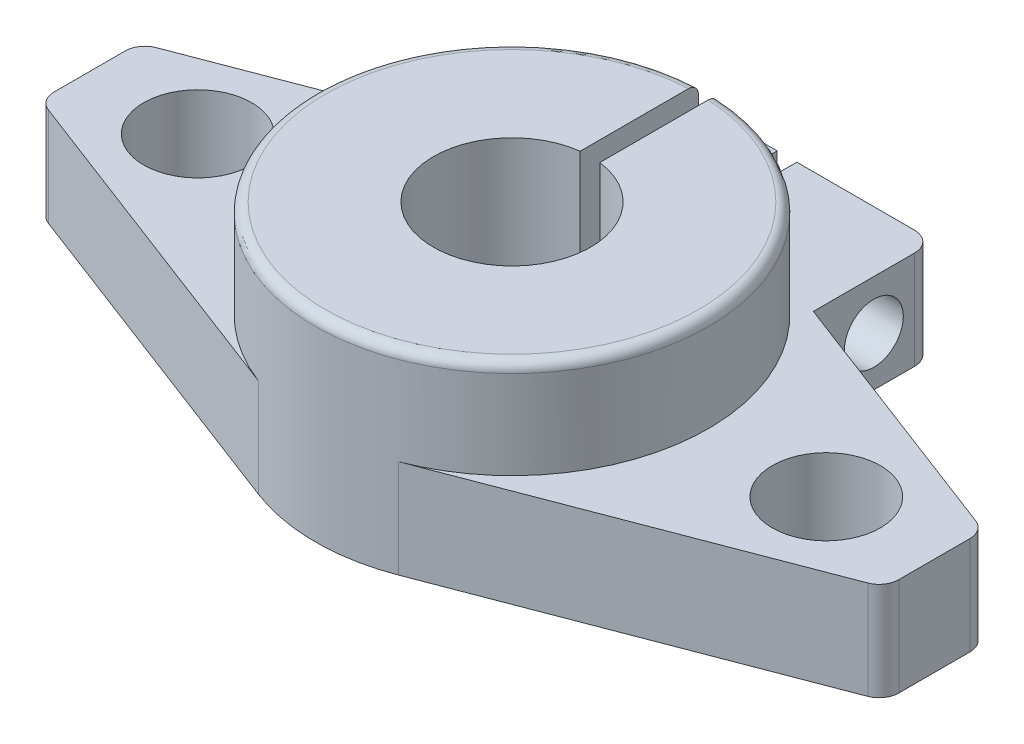
ISO-10303-21;
HEADER;
FILE_DESCRIPTION(('STEP AP214'),'2;1');
FILE_NAME('part.step','',(''),(''),'','','');
FILE_SCHEMA(('AUTOMOTIVE_DESIGN { 1 0 10303 214 1 1 1 1 }'));
ENDSEC;
DATA;
#1=APPLICATION_CONTEXT('core data for automotive mechanical design processes');
#2=APPLICATION_PROTOCOL_DEFINITION('international standard','automotive_design',2000,#1);
#3=PRODUCT_CONTEXT('',#1,'mechanical');
#4=PRODUCT('Part','Part','',(#3));
#5=PRODUCT_RELATED_PRODUCT_CATEGORY('part','',(#4));
#6=PRODUCT_DEFINITION_FORMATION('','',#4);
#7=PRODUCT_DEFINITION_CONTEXT('part definition',#1,'design');
#8=PRODUCT_DEFINITION('design','',#6,#7);
#9=PRODUCT_DEFINITION_SHAPE('','',#8);
#10=(LENGTH_UNIT() NAMED_UNIT(*) SI_UNIT(.MILLI.,.METRE.));
#11=(NAMED_UNIT(*) PLANE_ANGLE_UNIT() SI_UNIT($,.RADIAN.));
#12=(NAMED_UNIT(*) SI_UNIT($,.STERADIAN.) SOLID_ANGLE_UNIT());
#13=UNCERTAINTY_MEASURE_WITH_UNIT(LENGTH_MEASURE(1.E-05),#10,'distance_accuracy_value','');
#14=(GEOMETRIC_REPRESENTATION_CONTEXT(3) GLOBAL_UNCERTAINTY_ASSIGNED_CONTEXT((#13)) GLOBAL_UNIT_ASSIGNED_CONTEXT((#10,
#11,#12)) REPRESENTATION_CONTEXT('',''));
#15=CARTESIAN_POINT('',(0.,0.,0.));
#16=DIRECTION('',(0.,0.,1.));
#17=DIRECTION('',(1.,0.,0.));
#18=AXIS2_PLACEMENT_3D('',#15,#16,#17);
#19=CARTESIAN_POINT('',(0.,5.,0.));
#20=DIRECTION('',(0.,1.,0.));
#21=DIRECTION('',(0.,0.,1.));
#22=AXIS2_PLACEMENT_3D('',#19,#20,#21);
#23=PLANE('',#22);
#24=DIRECTION('',(-1.,0.,0.));
#25=VECTOR('',#24,1.);
#26=CARTESIAN_POINT('',(-0.5,5.,-14.));
#27=LINE('',#26,#25);
#28=CARTESIAN_POINT('',(-0.5,5.,-14.));
#29=VERTEX_POINT('',#28);
#30=CARTESIAN_POINT('',(-6.5,5.,-14.));
#31=VERTEX_POINT('',#30);
#32=EDGE_CURVE('E388',#29,#31,#27,.T.);
#33=ORIENTED_EDGE('',*,*,#32,.T.);
#34=CARTESIAN_POINT('',(-6.5,5.,-13.));
#35=DIRECTION('',(0.,1.,0.));
#36=DIRECTION('',(0.,0.,1.));
#37=AXIS2_PLACEMENT_3D('',#34,#35,#36);
#38=CIRCLE('',#37,1.);
#39=CARTESIAN_POINT('',(-7.5,5.,-13.));
#40=VERTEX_POINT('',#39);
#41=EDGE_CURVE('E11',#31,#40,#38,.T.);
#42=ORIENTED_EDGE('',*,*,#41,.T.);
#43=DIRECTION('',(0.,0.,1.));
#44=VECTOR('',#43,1.);
#45=CARTESIAN_POINT('',(-7.5,5.,-14.));
#46=LINE('',#45,#44);
#47=CARTESIAN_POINT('',(-7.5,5.,-7.84158601756617));
#48=VERTEX_POINT('',#47);
#49=EDGE_CURVE('E396',#40,#48,#46,.T.);
#50=ORIENTED_EDGE('',*,*,#49,.T.);
#51=DIRECTION('',(-0.93430439090657,0.,0.356476233615515));
#52=VECTOR('',#51,1.);
#53=CARTESIAN_POINT('',(-21.5,5.,-2.5));
#54=LINE('',#53,#52);
#55=CARTESIAN_POINT('',(-20.8564762336155,5.,-2.74553125374935));
#56=VERTEX_POINT('',#55);
#57=EDGE_CURVE('E398',#48,#56,#54,.T.);
#58=ORIENTED_EDGE('',*,*,#57,.T.);
#59=CARTESIAN_POINT('',(-20.5,5.,-1.81122686284278));
#60=DIRECTION('',(0.,1.,0.));
#61=DIRECTION('',(0.,0.,1.));
#62=AXIS2_PLACEMENT_3D('',#59,#60,#61);
#63=CIRCLE('',#62,1.);
#64=CARTESIAN_POINT('',(-21.5,5.,-1.81122686284278));
#65=VERTEX_POINT('',#64);
#66=EDGE_CURVE('E480',#56,#65,#63,.T.);
#67=ORIENTED_EDGE('',*,*,#66,.T.);
#68=DIRECTION('',(0.,0.,1.));
#69=VECTOR('',#68,1.);
#70=CARTESIAN_POINT('',(-21.5,5.,-2.5));
#71=LINE('',#70,#69);
#72=CARTESIAN_POINT('',(-21.5,5.,1.81122686284278));
#73=VERTEX_POINT('',#72);
#74=EDGE_CURVE('E349',#65,#73,#71,.T.);
#75=ORIENTED_EDGE('',*,*,#74,.T.);
#76=CARTESIAN_POINT('',(-20.5,5.,1.81122686284278));
#77=DIRECTION('',(0.,1.,0.));
#78=DIRECTION('',(0.,0.,1.));
#79=AXIS2_PLACEMENT_3D('',#76,#77,#78);
#80=CIRCLE('',#79,1.);
#81=CARTESIAN_POINT('',(-20.8564762336155,5.,2.74553125374935));
#82=VERTEX_POINT('',#81);
#83=EDGE_CURVE('E344',#73,#82,#80,.T.);
#84=ORIENTED_EDGE('',*,*,#83,.T.);
#85=DIRECTION('',(0.93430439090657,0.,0.356476233615515));
#86=VECTOR('',#85,1.);
#87=CARTESIAN_POINT('',(-21.5,5.,2.5));
#88=LINE('',#87,#86);
#89=CARTESIAN_POINT('',(-3.56476233615515,5.,9.3430439090657));
#90=VERTEX_POINT('',#89);
#91=EDGE_CURVE('E345',#82,#90,#88,.T.);
#92=ORIENTED_EDGE('',*,*,#91,.T.);
#93=CARTESIAN_POINT('',(0.,5.,0.));
#94=DIRECTION('',(0.,1.,0.));
#95=DIRECTION('',(0.,0.,1.));
#96=AXIS2_PLACEMENT_3D('',#93,#94,#95);
#97=CIRCLE('',#96,10.);
#98=CARTESIAN_POINT('',(-0.5,5.,-9.9874921777191));
#99=VERTEX_POINT('',#98);
#100=EDGE_CURVE('E217',#99,#90,#97,.T.);
#101=ORIENTED_EDGE('',*,*,#100,.F.);
#102=DIRECTION('',(0.,0.,-1.));
#103=VECTOR('',#102,1.);
#104=CARTESIAN_POINT('',(-0.5,5.,-9.98749217771909));
#105=LINE('',#104,#103);
#106=EDGE_CURVE('E386',#99,#29,#105,.T.);
#107=ORIENTED_EDGE('',*,*,#106,.T.);
#108=EDGE_LOOP('',(#33,#42,#50,#58,#67,#75,#84,#92,#101,#107));
#109=FACE_BOUND('',#108,.T.);
#110=CARTESIAN_POINT('',(-16.,5.,0.));
#111=DIRECTION('',(0.,1.,0.));
#112=DIRECTION('',(0.,0.,1.));
#113=AXIS2_PLACEMENT_3D('',#110,#111,#112);
#114=CIRCLE('',#113,2.75);
#115=CARTESIAN_POINT('',(-16.,5.,2.75));
#116=VERTEX_POINT('',#115);
#117=EDGE_CURVE('E416',#116,#116,#114,.T.);
#118=ORIENTED_EDGE('',*,*,#117,.F.);
#119=EDGE_LOOP('',(#118));
#120=FACE_BOUND('',#119,.T.);
#121=ADVANCED_FACE('F36',(#109,#120),#23,.T.);
#122=DIRECTION('',(0.,0.,-1.));
#123=VECTOR('',#122,1.);
#124=CARTESIAN_POINT('',(7.5,5.,-14.));
#125=LINE('',#124,#123);
#126=CARTESIAN_POINT('',(7.5,5.,-7.84158601756617));
#127=VERTEX_POINT('',#126);
#128=CARTESIAN_POINT('',(7.5,5.,-13.));
#129=VERTEX_POINT('',#128);
#130=EDGE_CURVE('E408',#127,#129,#125,.T.);
#131=ORIENTED_EDGE('',*,*,#130,.T.);
#132=CARTESIAN_POINT('',(6.5,5.,-13.));
#133=DIRECTION('',(0.,1.,0.));
#134=DIRECTION('',(0.,0.,1.));
#135=AXIS2_PLACEMENT_3D('',#132,#133,#134);
#136=CIRCLE('',#135,1.);
#137=CARTESIAN_POINT('',(6.5,5.,-14.));
#138=VERTEX_POINT('',#137);
#139=EDGE_CURVE('E498',#129,#138,#136,.T.);
#140=ORIENTED_EDGE('',*,*,#139,.T.);
#141=DIRECTION('',(-1.,0.,0.));
#142=VECTOR('',#141,1.);
#143=CARTESIAN_POINT('',(0.5,5.,-14.));
#144=LINE('',#143,#142);
#145=CARTESIAN_POINT('',(0.5,5.,-14.));
#146=VERTEX_POINT('',#145);
#147=EDGE_CURVE('E411',#138,#146,#144,.T.);
#148=ORIENTED_EDGE('',*,*,#147,.T.);
#149=DIRECTION('',(0.,0.,1.));
#150=VECTOR('',#149,1.);
#151=CARTESIAN_POINT('',(0.5,5.,-9.98749217771909));
#152=LINE('',#151,#150);
#153=CARTESIAN_POINT('',(0.5,5.,-9.98749217771909));
#154=VERTEX_POINT('',#153);
#155=EDGE_CURVE('E235',#146,#154,#152,.T.);
#156=ORIENTED_EDGE('',*,*,#155,.T.);
#157=CARTESIAN_POINT('',(3.56476233615516,5.,9.3430439090657));
#158=VERTEX_POINT('',#157);
#159=EDGE_CURVE('E200',#158,#154,#97,.T.);
#160=ORIENTED_EDGE('',*,*,#159,.F.);
#161=DIRECTION('',(0.93430439090657,0.,-0.356476233615515));
#162=VECTOR('',#161,1.);
#163=CARTESIAN_POINT('',(21.5,5.,2.5));
#164=LINE('',#163,#162);
#165=CARTESIAN_POINT('',(20.8564762336155,5.,2.74553125374935));
#166=VERTEX_POINT('',#165);
#167=EDGE_CURVE('E348',#158,#166,#164,.T.);
#168=ORIENTED_EDGE('',*,*,#167,.T.);
#169=CARTESIAN_POINT('',(20.5,5.,1.81122686284278));
#170=DIRECTION('',(0.,1.,0.));
#171=DIRECTION('',(0.,0.,1.));
#172=AXIS2_PLACEMENT_3D('',#169,#170,#171);
#173=CIRCLE('',#172,1.);
#174=CARTESIAN_POINT('',(21.5,5.,1.81122686284278));
#175=VERTEX_POINT('',#174);
#176=EDGE_CURVE('E329',#166,#175,#173,.T.);
#177=ORIENTED_EDGE('',*,*,#176,.T.);
#178=DIRECTION('',(0.,0.,-1.));
#179=VECTOR('',#178,1.);
#180=CARTESIAN_POINT('',(21.5,5.,-2.5));
#181=LINE('',#180,#179);
#182=CARTESIAN_POINT('',(21.5,5.,-1.81122686284278));
#183=VERTEX_POINT('',#182);
#184=EDGE_CURVE('E403',#175,#183,#181,.T.);
#185=ORIENTED_EDGE('',*,*,#184,.T.);
#186=CARTESIAN_POINT('',(20.5,5.,-1.81122686284278));
#187=DIRECTION('',(0.,1.,0.));
#188=DIRECTION('',(0.,0.,1.));
#189=AXIS2_PLACEMENT_3D('',#186,#187,#188);
#190=CIRCLE('',#189,1.);
#191=CARTESIAN_POINT('',(20.8564762336155,5.,-2.74553125374935));
#192=VERTEX_POINT('',#191);
#193=EDGE_CURVE('E477',#183,#192,#190,.T.);
#194=ORIENTED_EDGE('',*,*,#193,.T.);
#195=DIRECTION('',(-0.93430439090657,0.,-0.356476233615515));
#196=VECTOR('',#195,1.);
#197=CARTESIAN_POINT('',(21.5,5.,-2.5));
#198=LINE('',#197,#196);
#199=EDGE_CURVE('E406',#192,#127,#198,.T.);
#200=ORIENTED_EDGE('',*,*,#199,.T.);
#201=EDGE_LOOP('',(#131,#140,#148,#156,#160,#168,#177,#185,#194,#200));
#202=FACE_BOUND('',#201,.T.);
#203=CARTESIAN_POINT('',(16.,5.,0.));
#204=DIRECTION('',(0.,1.,0.));
#205=DIRECTION('',(0.,0.,1.));
#206=AXIS2_PLACEMENT_3D('',#203,#204,#205);
#207=CIRCLE('',#206,2.75);
#208=CARTESIAN_POINT('',(16.,5.,2.75));
#209=VERTEX_POINT('',#208);
#210=EDGE_CURVE('E769',#209,#209,#207,.T.);
#211=ORIENTED_EDGE('',*,*,#210,.F.);
#212=EDGE_LOOP('',(#211));
#213=FACE_BOUND('',#212,.T.);
#214=ADVANCED_FACE('F446',(#202,#213),#23,.T.);
#215=CARTESIAN_POINT('',(0.,0.,0.));
#216=DIRECTION('',(0.,1.,0.));
#217=DIRECTION('',(0.,0.,1.));
#218=AXIS2_PLACEMENT_3D('',#215,#216,#217);
#219=PLANE('',#218);
#220=CARTESIAN_POINT('',(-16.,0.,0.));
#221=DIRECTION('',(0.,1.,0.));
#222=DIRECTION('',(0.,0.,1.));
#223=AXIS2_PLACEMENT_3D('',#220,#221,#222);
#224=CIRCLE('',#223,2.75);
#225=CARTESIAN_POINT('',(-16.,0.,2.75));
#226=VERTEX_POINT('',#225);
#227=EDGE_CURVE('E393',#226,#226,#224,.T.);
#228=ORIENTED_EDGE('',*,*,#227,.T.);
#229=EDGE_LOOP('',(#228));
#230=FACE_BOUND('',#229,.T.);
#231=DIRECTION('',(-1.,0.,0.));
#232=VECTOR('',#231,1.);
#233=CARTESIAN_POINT('',(0.5,0.,-14.));
#234=LINE('',#233,#232);
#235=CARTESIAN_POINT('',(6.5,0.,-14.));
#236=VERTEX_POINT('',#235);
#237=CARTESIAN_POINT('',(0.5,0.,-14.));
#238=VERTEX_POINT('',#237);
#239=EDGE_CURVE('E441',#236,#238,#234,.T.);
#240=ORIENTED_EDGE('',*,*,#239,.F.);
#241=CARTESIAN_POINT('',(6.5,0.,-13.));
#242=DIRECTION('',(0.,1.,0.));
#243=DIRECTION('',(0.,0.,1.));
#244=AXIS2_PLACEMENT_3D('',#241,#242,#243);
#245=CIRCLE('',#244,1.);
#246=CARTESIAN_POINT('',(7.5,0.,-13.));
#247=VERTEX_POINT('',#246);
#248=EDGE_CURVE('E494',#236,#247,#245,.F.);
#249=ORIENTED_EDGE('',*,*,#248,.T.);
#250=DIRECTION('',(0.,0.,-1.));
#251=VECTOR('',#250,1.);
#252=CARTESIAN_POINT('',(7.5,0.,-14.));
#253=LINE('',#252,#251);
#254=CARTESIAN_POINT('',(7.5,0.,-7.84158601756617));
#255=VERTEX_POINT('',#254);
#256=EDGE_CURVE('E439',#255,#247,#253,.T.);
#257=ORIENTED_EDGE('',*,*,#256,.F.);
#258=DIRECTION('',(-0.93430439090657,0.,-0.356476233615515));
#259=VECTOR('',#258,1.);
#260=CARTESIAN_POINT('',(21.5,0.,-2.5));
#261=LINE('',#260,#259);
#262=CARTESIAN_POINT('',(20.8564762336155,0.,-2.74553125374935));
#263=VERTEX_POINT('',#262);
#264=EDGE_CURVE('E437',#263,#255,#261,.T.);
#265=ORIENTED_EDGE('',*,*,#264,.F.);
#266=CARTESIAN_POINT('',(20.5,0.,-1.81122686284278));
#267=DIRECTION('',(0.,1.,0.));
#268=DIRECTION('',(0.,0.,1.));
#269=AXIS2_PLACEMENT_3D('',#266,#267,#268);
#270=CIRCLE('',#269,1.);
#271=CARTESIAN_POINT('',(21.5,0.,-1.81122686284278));
#272=VERTEX_POINT('',#271);
#273=EDGE_CURVE('E336',#263,#272,#270,.F.);
#274=ORIENTED_EDGE('',*,*,#273,.T.);
#275=DIRECTION('',(0.,0.,-1.));
#276=VECTOR('',#275,1.);
#277=CARTESIAN_POINT('',(21.5,0.,-2.5));
#278=LINE('',#277,#276);
#279=CARTESIAN_POINT('',(21.5,0.,1.81122686284278));
#280=VERTEX_POINT('',#279);
#281=EDGE_CURVE('E434',#280,#272,#278,.T.);
#282=ORIENTED_EDGE('',*,*,#281,.F.);
#283=CARTESIAN_POINT('',(20.5,0.,1.81122686284278));
#284=DIRECTION('',(0.,1.,0.));
#285=DIRECTION('',(0.,0.,1.));
#286=AXIS2_PLACEMENT_3D('',#283,#284,#285);
#287=CIRCLE('',#286,1.);
#288=CARTESIAN_POINT('',(20.8564762336155,0.,2.74553125374935));
#289=VERTEX_POINT('',#288);
#290=EDGE_CURVE('E325',#280,#289,#287,.F.);
#291=ORIENTED_EDGE('',*,*,#290,.T.);
#292=DIRECTION('',(0.93430439090657,0.,-0.356476233615515));
#293=VECTOR('',#292,1.);
#294=CARTESIAN_POINT('',(21.5,0.,2.5));
#295=LINE('',#294,#293);
#296=CARTESIAN_POINT('',(3.56476233615516,0.,9.3430439090657));
#297=VERTEX_POINT('',#296);
#298=EDGE_CURVE('E432',#297,#289,#295,.T.);
#299=ORIENTED_EDGE('',*,*,#298,.F.);
#300=CARTESIAN_POINT('',(0.,0.,0.));
#301=DIRECTION('',(0.,1.,0.));
#302=DIRECTION('',(0.,0.,1.));
#303=AXIS2_PLACEMENT_3D('',#300,#301,#302);
#304=CIRCLE('',#303,10.);
#305=CARTESIAN_POINT('',(-3.56476233615515,0.,9.3430439090657));
#306=VERTEX_POINT('',#305);
#307=EDGE_CURVE('E430',#306,#297,#304,.T.);
#308=ORIENTED_EDGE('',*,*,#307,.F.);
#309=DIRECTION('',(0.93430439090657,0.,0.356476233615515));
#310=VECTOR('',#309,1.);
#311=CARTESIAN_POINT('',(-21.5,0.,2.5));
#312=LINE('',#311,#310);
#313=CARTESIAN_POINT('',(-20.8564762336155,0.,2.74553125374935));
#314=VERTEX_POINT('',#313);
#315=EDGE_CURVE('E428',#314,#306,#312,.T.);
#316=ORIENTED_EDGE('',*,*,#315,.F.);
#317=CARTESIAN_POINT('',(-20.5,0.,1.81122686284278));
#318=DIRECTION('',(0.,1.,0.));
#319=DIRECTION('',(0.,0.,1.));
#320=AXIS2_PLACEMENT_3D('',#317,#318,#319);
#321=CIRCLE('',#320,1.);
#322=CARTESIAN_POINT('',(-21.5,0.,1.81122686284278));
#323=VERTEX_POINT('',#322);
#324=EDGE_CURVE('E338',#314,#323,#321,.F.);
#325=ORIENTED_EDGE('',*,*,#324,.T.);
#326=DIRECTION('',(0.,0.,1.));
#327=VECTOR('',#326,1.);
#328=CARTESIAN_POINT('',(-21.5,0.,-2.5));
#329=LINE('',#328,#327);
#330=CARTESIAN_POINT('',(-21.5,0.,-1.81122686284278));
#331=VERTEX_POINT('',#330);
#332=EDGE_CURVE('E425',#331,#323,#329,.T.);
#333=ORIENTED_EDGE('',*,*,#332,.F.);
#334=CARTESIAN_POINT('',(-20.5,0.,-1.81122686284278));
#335=DIRECTION('',(0.,1.,0.));
#336=DIRECTION('',(0.,0.,1.));
#337=AXIS2_PLACEMENT_3D('',#334,#335,#336);
#338=CIRCLE('',#337,1.);
#339=CARTESIAN_POINT('',(-20.8564762336155,0.,-2.74553125374935));
#340=VERTEX_POINT('',#339);
#341=EDGE_CURVE('E340',#331,#340,#338,.F.);
#342=ORIENTED_EDGE('',*,*,#341,.T.);
#343=DIRECTION('',(-0.93430439090657,0.,0.356476233615515));
#344=VECTOR('',#343,1.);
#345=CARTESIAN_POINT('',(-21.5,0.,-2.5));
#346=LINE('',#345,#344);
#347=CARTESIAN_POINT('',(-7.5,0.,-7.84158601756617));
#348=VERTEX_POINT('',#347);
#349=EDGE_CURVE('E422',#348,#340,#346,.T.);
#350=ORIENTED_EDGE('',*,*,#349,.F.);
#351=DIRECTION('',(0.,0.,1.));
#352=VECTOR('',#351,1.);
#353=CARTESIAN_POINT('',(-7.5,0.,-14.));
#354=LINE('',#353,#352);
#355=CARTESIAN_POINT('',(-7.5,0.,-13.));
#356=VERTEX_POINT('',#355);
#357=EDGE_CURVE('E420',#356,#348,#354,.T.);
#358=ORIENTED_EDGE('',*,*,#357,.F.);
#359=CARTESIAN_POINT('',(-6.5,0.,-13.));
#360=DIRECTION('',(0.,1.,0.));
#361=DIRECTION('',(0.,0.,1.));
#362=AXIS2_PLACEMENT_3D('',#359,#360,#361);
#363=CIRCLE('',#362,1.);
#364=CARTESIAN_POINT('',(-6.5,0.,-14.));
#365=VERTEX_POINT('',#364);
#366=EDGE_CURVE('E492',#356,#365,#363,.F.);
#367=ORIENTED_EDGE('',*,*,#366,.T.);
#368=DIRECTION('',(-1.,0.,0.));
#369=VECTOR('',#368,1.);
#370=CARTESIAN_POINT('',(-0.5,0.,-14.));
#371=LINE('',#370,#369);
#372=CARTESIAN_POINT('',(-0.5,0.,-14.));
#373=VERTEX_POINT('',#372);
#374=EDGE_CURVE('E418',#373,#365,#371,.T.);
#375=ORIENTED_EDGE('',*,*,#374,.F.);
#376=DIRECTION('',(0.,0.,-1.));
#377=VECTOR('',#376,1.);
#378=CARTESIAN_POINT('',(-0.5,0.,-9.98749217771909));
#379=LINE('',#378,#377);
#380=CARTESIAN_POINT('',(-0.5,0.,-3.96862696659689));
#381=VERTEX_POINT('',#380);
#382=EDGE_CURVE('E415',#381,#373,#379,.T.);
#383=ORIENTED_EDGE('',*,*,#382,.F.);
#384=CARTESIAN_POINT('',(0.,0.,0.));
#385=DIRECTION('',(0.,-1.,0.));
#386=DIRECTION('',(0.,0.,1.));
#387=AXIS2_PLACEMENT_3D('',#384,#385,#386);
#388=CIRCLE('',#387,4.);
#389=CARTESIAN_POINT('',(0.5,0.,-3.96862696659689));
#390=VERTEX_POINT('',#389);
#391=EDGE_CURVE('E198',#390,#381,#388,.T.);
#392=ORIENTED_EDGE('',*,*,#391,.F.);
#393=DIRECTION('',(0.,0.,1.));
#394=VECTOR('',#393,1.);
#395=CARTESIAN_POINT('',(0.5,0.,-9.98749217771909));
#396=LINE('',#395,#394);
#397=EDGE_CURVE('E389',#238,#390,#396,.T.);
#398=ORIENTED_EDGE('',*,*,#397,.F.);
#399=EDGE_LOOP('',(#240,#249,#257,#265,#274,#282,#291,#299,#308,#316,#325,#333,#342,#350,#358,
#367,#375,#383,#392,#398));
#400=FACE_BOUND('',#399,.T.);
#401=CARTESIAN_POINT('',(16.,0.,0.));
#402=DIRECTION('',(0.,1.,0.));
#403=DIRECTION('',(0.,0.,1.));
#404=AXIS2_PLACEMENT_3D('',#401,#402,#403);
#405=CIRCLE('',#404,2.75);
#406=CARTESIAN_POINT('',(16.,0.,2.75));
#407=VERTEX_POINT('',#406);
#408=EDGE_CURVE('E767',#407,#407,#405,.T.);
#409=ORIENTED_EDGE('',*,*,#408,.T.);
#410=EDGE_LOOP('',(#409));
#411=FACE_BOUND('',#410,.T.);
#412=ADVANCED_FACE('F269',(#230,#400,#411),#219,.F.);
#413=CARTESIAN_POINT('',(0.,5.,0.));
#414=DIRECTION('',(0.,-1.,0.));
#415=DIRECTION('',(0.,0.,-1.));
#416=AXIS2_PLACEMENT_3D('',#413,#414,#415);
#417=CYLINDRICAL_SURFACE('',#416,4.);
#418=ORIENTED_EDGE('',*,*,#391,.T.);
#419=DIRECTION('',(0.,-1.,0.));
#420=VECTOR('',#419,1.);
#421=CARTESIAN_POINT('',(-0.5,5.,-3.96862696659689));
#422=LINE('',#421,#420);
#423=CARTESIAN_POINT('',(-0.5,10.,-3.96862696659689));
#424=VERTEX_POINT('',#423);
#425=EDGE_CURVE('E191',#424,#381,#422,.T.);
#426=ORIENTED_EDGE('',*,*,#425,.F.);
#427=CARTESIAN_POINT('',(0.,10.,0.));
#428=DIRECTION('',(0.,-1.,0.));
#429=DIRECTION('',(0.,0.,1.));
#430=AXIS2_PLACEMENT_3D('',#427,#428,#429);
#431=CIRCLE('',#430,4.);
#432=CARTESIAN_POINT('',(0.5,10.,-3.96862696659689));
#433=VERTEX_POINT('',#432);
#434=EDGE_CURVE('E196',#433,#424,#431,.T.);
#435=ORIENTED_EDGE('',*,*,#434,.F.);
#436=DIRECTION('',(0.,-1.,0.));
#437=VECTOR('',#436,1.);
#438=CARTESIAN_POINT('',(0.5,5.,-3.96862696659689));
#439=LINE('',#438,#437);
#440=EDGE_CURVE('E381',#433,#390,#439,.T.);
#441=ORIENTED_EDGE('',*,*,#440,.T.);
#442=EDGE_LOOP('',(#418,#426,#435,#441));
#443=FACE_BOUND('',#442,.T.);
#444=ADVANCED_FACE('F193',(#443),#417,.F.);
#445=CARTESIAN_POINT('',(-0.5,5.,-9.98749217771909));
#446=DIRECTION('',(-1.,0.,0.));
#447=DIRECTION('',(0.,0.,1.));
#448=AXIS2_PLACEMENT_3D('',#445,#446,#447);
#449=PLANE('',#448);
#450=CARTESIAN_POINT('',(-0.5,2.5,-10.9207930087831));
#451=DIRECTION('',(-1.,0.,0.));
#452=DIRECTION('',(0.,0.,1.));
#453=AXIS2_PLACEMENT_3D('',#450,#451,#452);
#454=CIRCLE('',#453,1.5);
#455=CARTESIAN_POINT('',(-0.500000000000001,2.5,-9.42079300878309));
#456=VERTEX_POINT('',#455);
#457=EDGE_CURVE('E220',#456,#456,#454,.T.);
#458=ORIENTED_EDGE('',*,*,#457,.T.);
#459=EDGE_LOOP('',(#458));
#460=FACE_BOUND('',#459,.T.);
#461=DIRECTION('',(0.,-1.,0.));
#462=VECTOR('',#461,1.);
#463=CARTESIAN_POINT('',(-0.499999999999997,10.,-9.9874921777191));
#464=LINE('',#463,#462);
#465=CARTESIAN_POINT('',(-0.499999999999997,9.5,-9.9874921777191));
#466=VERTEX_POINT('',#465);
#467=EDGE_CURVE('E245',#466,#99,#464,.T.);
#468=ORIENTED_EDGE('',*,*,#467,.F.);
#469=CARTESIAN_POINT('',(-0.499999999999997,9.5,-9.98749217771909));
#470=CARTESIAN_POINT('',(-0.499999999999999,9.52810326861318,-9.98751620948402));
#471=CARTESIAN_POINT('',(-0.5,9.55619919985415,-9.9851212731618));
#472=CARTESIAN_POINT('',(-0.500000000000001,9.61157346459877,-9.97567103551276));
#473=CARTESIAN_POINT('',(-0.5,9.63885244876249,-9.96861955198559));
#474=CARTESIAN_POINT('',(-0.5,9.69185089269416,-9.95002890297945));
#475=CARTESIAN_POINT('',(-0.5,9.71756961551152,-9.93848763564793));
#476=CARTESIAN_POINT('',(-0.5,9.76670190365465,-9.91125685072349));
#477=CARTESIAN_POINT('',(-0.5,9.79011585205196,-9.89556802409042));
#478=CARTESIAN_POINT('',(-0.5,9.83399284156846,-9.86047698889603));
#479=CARTESIAN_POINT('',(-0.5,9.85445432014158,-9.84107282660264));
#480=CARTESIAN_POINT('',(-0.5,9.89183796761889,-9.7991040074595));
#481=CARTESIAN_POINT('',(-0.5,9.90875943669601,-9.77653872715537));
#482=CARTESIAN_POINT('',(-0.5,9.9386017876494,-9.72886107668858));
#483=CARTESIAN_POINT('',(-0.5,9.95151709682579,-9.70374522244322));
#484=CARTESIAN_POINT('',(-0.5,9.97294712330037,-9.65170829204656));
#485=CARTESIAN_POINT('',(-0.5,9.98146433049339,-9.6247882470754));
#486=CARTESIAN_POINT('',(-0.5,9.99176417502659,-9.57922815460075));
#487=CARTESIAN_POINT('',(-0.5,9.99485077045508,-9.56087222424545));
#488=CARTESIAN_POINT('',(-0.5,9.9989684284394,-9.52395772198814));
#489=CARTESIAN_POINT('',(-0.5,10.0000024064873,-9.50539947520595));
#490=CARTESIAN_POINT('',(-0.5,10.,-9.48683298050514));
#491=B_SPLINE_CURVE_WITH_KNOTS('',3,(#469,#470,#471,#472,#473,#474,#475,#476,#477,#478,#479,
#480,#481,#482,#483,#484,#485,#486,#487,#488,#489,#490),.UNSPECIFIED.,.F.,.F.,(4,2,2,2,2,2,2,2,
2,2,4),(0.,0.0841973902555138,0.168325834504239,0.252493710225416,0.336647572882433,
0.420845810508162,0.505060677648273,0.589392170465926,0.673675868259291,0.729409740916319,
0.785064393618538),.UNSPECIFIED.);
#492=CARTESIAN_POINT('',(-0.5,10.,-9.48683298050514));
#493=VERTEX_POINT('',#492);
#494=EDGE_CURVE('E208',#466,#493,#491,.T.);
#495=ORIENTED_EDGE('',*,*,#494,.T.);
#496=DIRECTION('',(0.,0.,-1.));
#497=VECTOR('',#496,1.);
#498=CARTESIAN_POINT('',(-0.5,10.,-3.96862696659689));
#499=LINE('',#498,#497);
#500=EDGE_CURVE('E204',#424,#493,#499,.T.);
#501=ORIENTED_EDGE('',*,*,#500,.F.);
#502=ORIENTED_EDGE('',*,*,#425,.T.);
#503=ORIENTED_EDGE('',*,*,#382,.T.);
#504=DIRECTION('',(0.,-1.,0.));
#505=VECTOR('',#504,1.);
#506=CARTESIAN_POINT('',(-0.5,5.,-14.));
#507=LINE('',#506,#505);
#508=EDGE_CURVE('E201',#29,#373,#507,.T.);
#509=ORIENTED_EDGE('',*,*,#508,.F.);
#510=ORIENTED_EDGE('',*,*,#106,.F.);
#511=EDGE_LOOP('',(#468,#495,#501,#502,#503,#509,#510));
#512=FACE_BOUND('',#511,.T.);
#513=ADVANCED_FACE('F206',(#460,#512),#449,.F.);
#514=CARTESIAN_POINT('',(-0.5,5.,-14.));
#515=DIRECTION('',(0.,0.,1.));
#516=DIRECTION('',(1.,0.,0.));
#517=AXIS2_PLACEMENT_3D('',#514,#515,#516);
#518=PLANE('',#517);
#519=ORIENTED_EDGE('',*,*,#374,.T.);
#520=DIRECTION('',(0.,-1.,0.));
#521=VECTOR('',#520,1.);
#522=CARTESIAN_POINT('',(-6.5,5.,-14.));
#523=LINE('',#522,#521);
#524=EDGE_CURVE('E44',#365,#31,#523,.F.);
#525=ORIENTED_EDGE('',*,*,#524,.T.);
#526=ORIENTED_EDGE('',*,*,#32,.F.);
#527=ORIENTED_EDGE('',*,*,#508,.T.);
#528=EDGE_LOOP('',(#519,#525,#526,#527));
#529=FACE_BOUND('',#528,.T.);
#530=ADVANCED_FACE('F309',(#529),#518,.F.);
#531=CARTESIAN_POINT('',(-7.5,5.,-14.));
#532=DIRECTION('',(1.,0.,0.));
#533=DIRECTION('',(0.,0.,-1.));
#534=AXIS2_PLACEMENT_3D('',#531,#532,#533);
#535=PLANE('',#534);
#536=CARTESIAN_POINT('',(-7.5,2.5,-10.9207930087831));
#537=DIRECTION('',(1.,0.,0.));
#538=DIRECTION('',(0.,0.,-1.));
#539=AXIS2_PLACEMENT_3D('',#536,#537,#538);
#540=CIRCLE('',#539,1.5);
#541=CARTESIAN_POINT('',(-7.5,2.5,-12.4207930087831));
#542=VERTEX_POINT('',#541);
#543=EDGE_CURVE('E488',#542,#542,#540,.T.);
#544=ORIENTED_EDGE('',*,*,#543,.T.);
#545=EDGE_LOOP('',(#544));
#546=FACE_BOUND('',#545,.T.);
#547=ORIENTED_EDGE('',*,*,#49,.F.);
#548=DIRECTION('',(0.,-1.,0.));
#549=VECTOR('',#548,1.);
#550=CARTESIAN_POINT('',(-7.5,5.,-13.));
#551=LINE('',#550,#549);
#552=EDGE_CURVE('E500',#40,#356,#551,.T.);
#553=ORIENTED_EDGE('',*,*,#552,.T.);
#554=ORIENTED_EDGE('',*,*,#357,.T.);
#555=DIRECTION('',(0.,-1.,0.));
#556=VECTOR('',#555,1.);
#557=CARTESIAN_POINT('',(-7.5,5.,-7.84158601756617));
#558=LINE('',#557,#556);
#559=EDGE_CURVE('E359',#48,#348,#558,.T.);
#560=ORIENTED_EDGE('',*,*,#559,.F.);
#561=EDGE_LOOP('',(#547,#553,#554,#560));
#562=FACE_BOUND('',#561,.T.);
#563=ADVANCED_FACE('F305',(#546,#562),#535,.F.);
#564=CARTESIAN_POINT('',(-21.5,5.,-2.5));
#565=DIRECTION('',(0.356476233615515,0.,0.93430439090657));
#566=DIRECTION('',(0.93430439090657,0.,-0.356476233615515));
#567=AXIS2_PLACEMENT_3D('',#564,#565,#566);
#568=PLANE('',#567);
#569=ORIENTED_EDGE('',*,*,#349,.T.);
#570=DIRECTION('',(0.,-1.,0.));
#571=VECTOR('',#570,1.);
#572=CARTESIAN_POINT('',(-20.8564762336155,5.,-2.74553125374935));
#573=LINE('',#572,#571);
#574=EDGE_CURVE('E342',#340,#56,#573,.F.);
#575=ORIENTED_EDGE('',*,*,#574,.T.);
#576=ORIENTED_EDGE('',*,*,#57,.F.);
#577=ORIENTED_EDGE('',*,*,#559,.T.);
#578=EDGE_LOOP('',(#569,#575,#576,#577));
#579=FACE_BOUND('',#578,.T.);
#580=ADVANCED_FACE('F301',(#579),#568,.F.);
#581=CARTESIAN_POINT('',(-21.5,5.,-2.5));
#582=DIRECTION('',(1.,0.,0.));
#583=DIRECTION('',(0.,0.,-1.));
#584=AXIS2_PLACEMENT_3D('',#581,#582,#583);
#585=PLANE('',#584);
#586=ORIENTED_EDGE('',*,*,#74,.F.);
#587=DIRECTION('',(0.,-1.,0.));
#588=VECTOR('',#587,1.);
#589=CARTESIAN_POINT('',(-21.5,5.,-1.81122686284278));
#590=LINE('',#589,#588);
#591=EDGE_CURVE('E333',#65,#331,#590,.T.);
#592=ORIENTED_EDGE('',*,*,#591,.T.);
#593=ORIENTED_EDGE('',*,*,#332,.T.);
#594=DIRECTION('',(0.,-1.,0.));
#595=VECTOR('',#594,1.);
#596=CARTESIAN_POINT('',(-21.5,5.,1.81122686284278));
#597=LINE('',#596,#595);
#598=EDGE_CURVE('E331',#323,#73,#597,.F.);
#599=ORIENTED_EDGE('',*,*,#598,.T.);
#600=EDGE_LOOP('',(#586,#592,#593,#599));
#601=FACE_BOUND('',#600,.T.);
#602=ADVANCED_FACE('F297',(#601),#585,.F.);
#603=CARTESIAN_POINT('',(-21.5,5.,2.5));
#604=DIRECTION('',(0.356476233615515,0.,-0.93430439090657));
#605=DIRECTION('',(-0.93430439090657,0.,-0.356476233615515));
#606=AXIS2_PLACEMENT_3D('',#603,#604,#605);
#607=PLANE('',#606);
#608=ORIENTED_EDGE('',*,*,#91,.F.);
#609=DIRECTION('',(0.,-1.,0.));
#610=VECTOR('',#609,1.);
#611=CARTESIAN_POINT('',(-20.8564762336155,5.,2.74553125374935));
#612=LINE('',#611,#610);
#613=EDGE_CURVE('E475',#82,#314,#612,.T.);
#614=ORIENTED_EDGE('',*,*,#613,.T.);
#615=ORIENTED_EDGE('',*,*,#315,.T.);
#616=DIRECTION('',(0.,-1.,0.));
#617=VECTOR('',#616,1.);
#618=CARTESIAN_POINT('',(-3.56476233615515,5.,9.3430439090657));
#619=LINE('',#618,#617);
#620=EDGE_CURVE('E356',#90,#306,#619,.T.);
#621=ORIENTED_EDGE('',*,*,#620,.F.);
#622=EDGE_LOOP('',(#608,#614,#615,#621));
#623=FACE_BOUND('',#622,.T.);
#624=ADVANCED_FACE('F293',(#623),#607,.F.);
#625=CARTESIAN_POINT('',(0.,5.,0.));
#626=DIRECTION('',(0.,-1.,0.));
#627=DIRECTION('',(0.,0.,-1.));
#628=AXIS2_PLACEMENT_3D('',#625,#626,#627);
#629=CYLINDRICAL_SURFACE('',#628,10.);
#630=DIRECTION('',(0.,-1.,0.));
#631=VECTOR('',#630,1.);
#632=CARTESIAN_POINT('',(0.5,10.,-9.98749217771909));
#633=LINE('',#632,#631);
#634=CARTESIAN_POINT('',(0.5,9.5,-9.98749217771909));
#635=VERTEX_POINT('',#634);
#636=EDGE_CURVE('E226',#635,#154,#633,.T.);
#637=ORIENTED_EDGE('',*,*,#636,.F.);
#638=CARTESIAN_POINT('',(0.,9.5,0.));
#639=DIRECTION('',(0.,1.,0.));
#640=DIRECTION('',(0.,0.,1.));
#641=AXIS2_PLACEMENT_3D('',#638,#639,#640);
#642=CIRCLE('',#641,10.);
#643=EDGE_CURVE('E255',#635,#466,#642,.F.);
#644=ORIENTED_EDGE('',*,*,#643,.T.);
#645=ORIENTED_EDGE('',*,*,#467,.T.);
#646=ORIENTED_EDGE('',*,*,#100,.T.);
#647=ORIENTED_EDGE('',*,*,#620,.T.);
#648=ORIENTED_EDGE('',*,*,#307,.T.);
#649=DIRECTION('',(0.,-1.,0.));
#650=VECTOR('',#649,1.);
#651=CARTESIAN_POINT('',(3.56476233615516,5.,9.3430439090657));
#652=LINE('',#651,#650);
#653=EDGE_CURVE('E240',#158,#297,#652,.T.);
#654=ORIENTED_EDGE('',*,*,#653,.F.);
#655=ORIENTED_EDGE('',*,*,#159,.T.);
#656=EDGE_LOOP('',(#637,#644,#645,#646,#647,#648,#654,#655));
#657=FACE_BOUND('',#656,.T.);
#658=ADVANCED_FACE('F289',(#657),#629,.T.);
#659=CARTESIAN_POINT('',(21.5,5.,2.5));
#660=DIRECTION('',(-0.356476233615515,0.,-0.93430439090657));
#661=DIRECTION('',(-0.93430439090657,0.,0.356476233615515));
#662=AXIS2_PLACEMENT_3D('',#659,#660,#661);
#663=PLANE('',#662);
#664=ORIENTED_EDGE('',*,*,#298,.T.);
#665=DIRECTION('',(0.,-1.,0.));
#666=VECTOR('',#665,1.);
#667=CARTESIAN_POINT('',(20.8564762336155,5.,2.74553125374935));
#668=LINE('',#667,#666);
#669=EDGE_CURVE('E327',#289,#166,#668,.F.);
#670=ORIENTED_EDGE('',*,*,#669,.T.);
#671=ORIENTED_EDGE('',*,*,#167,.F.);
#672=ORIENTED_EDGE('',*,*,#653,.T.);
#673=EDGE_LOOP('',(#664,#670,#671,#672));
#674=FACE_BOUND('',#673,.T.);
#675=ADVANCED_FACE('F285',(#674),#663,.F.);
#676=CARTESIAN_POINT('',(21.5,5.,-2.5));
#677=DIRECTION('',(-1.,0.,0.));
#678=DIRECTION('',(0.,0.,1.));
#679=AXIS2_PLACEMENT_3D('',#676,#677,#678);
#680=PLANE('',#679);
#681=ORIENTED_EDGE('',*,*,#281,.T.);
#682=DIRECTION('',(0.,-1.,0.));
#683=VECTOR('',#682,1.);
#684=CARTESIAN_POINT('',(21.5,5.,-1.81122686284278));
#685=LINE('',#684,#683);
#686=EDGE_CURVE('E473',#272,#183,#685,.F.);
#687=ORIENTED_EDGE('',*,*,#686,.T.);
#688=ORIENTED_EDGE('',*,*,#184,.F.);
#689=DIRECTION('',(0.,-1.,0.));
#690=VECTOR('',#689,1.);
#691=CARTESIAN_POINT('',(21.5,5.,1.81122686284278));
#692=LINE('',#691,#690);
#693=EDGE_CURVE('E322',#175,#280,#692,.T.);
#694=ORIENTED_EDGE('',*,*,#693,.T.);
#695=EDGE_LOOP('',(#681,#687,#688,#694));
#696=FACE_BOUND('',#695,.T.);
#697=ADVANCED_FACE('F281',(#696),#680,.F.);
#698=CARTESIAN_POINT('',(21.5,5.,-2.5));
#699=DIRECTION('',(-0.356476233615515,0.,0.93430439090657));
#700=DIRECTION('',(0.93430439090657,0.,0.356476233615515));
#701=AXIS2_PLACEMENT_3D('',#698,#699,#700);
#702=PLANE('',#701);
#703=ORIENTED_EDGE('',*,*,#199,.F.);
#704=DIRECTION('',(0.,-1.,0.));
#705=VECTOR('',#704,1.);
#706=CARTESIAN_POINT('',(20.8564762336155,5.,-2.74553125374935));
#707=LINE('',#706,#705);
#708=EDGE_CURVE('E472',#192,#263,#707,.T.);
#709=ORIENTED_EDGE('',*,*,#708,.T.);
#710=ORIENTED_EDGE('',*,*,#264,.T.);
#711=DIRECTION('',(0.,-1.,0.));
#712=VECTOR('',#711,1.);
#713=CARTESIAN_POINT('',(7.5,5.,-7.84158601756617));
#714=LINE('',#713,#712);
#715=EDGE_CURVE('E367',#127,#255,#714,.T.);
#716=ORIENTED_EDGE('',*,*,#715,.F.);
#717=EDGE_LOOP('',(#703,#709,#710,#716));
#718=FACE_BOUND('',#717,.T.);
#719=ADVANCED_FACE('F277',(#718),#702,.F.);
#720=CARTESIAN_POINT('',(7.5,5.,-14.));
#721=DIRECTION('',(-1.,0.,0.));
#722=DIRECTION('',(0.,0.,1.));
#723=AXIS2_PLACEMENT_3D('',#720,#721,#722);
#724=PLANE('',#723);
#725=CARTESIAN_POINT('',(7.5,2.5,-10.9207930087831));
#726=DIRECTION('',(1.,0.,0.));
#727=DIRECTION('',(0.,0.,-1.));
#728=AXIS2_PLACEMENT_3D('',#725,#726,#727);
#729=CIRCLE('',#728,1.5);
#730=CARTESIAN_POINT('',(7.5,2.5,-12.4207930087831));
#731=VERTEX_POINT('',#730);
#732=EDGE_CURVE('E489',#731,#731,#729,.T.);
#733=ORIENTED_EDGE('',*,*,#732,.F.);
#734=EDGE_LOOP('',(#733));
#735=FACE_BOUND('',#734,.T.);
#736=ORIENTED_EDGE('',*,*,#256,.T.);
#737=DIRECTION('',(0.,-1.,0.));
#738=VECTOR('',#737,1.);
#739=CARTESIAN_POINT('',(7.5,5.,-13.));
#740=LINE('',#739,#738);
#741=EDGE_CURVE('E496',#247,#129,#740,.F.);
#742=ORIENTED_EDGE('',*,*,#741,.T.);
#743=ORIENTED_EDGE('',*,*,#130,.F.);
#744=ORIENTED_EDGE('',*,*,#715,.T.);
#745=EDGE_LOOP('',(#736,#742,#743,#744));
#746=FACE_BOUND('',#745,.T.);
#747=ADVANCED_FACE('F273',(#735,#746),#724,.F.);
#748=CARTESIAN_POINT('',(0.5,5.,-14.));
#749=DIRECTION('',(0.,0.,1.));
#750=DIRECTION('',(1.,0.,0.));
#751=AXIS2_PLACEMENT_3D('',#748,#749,#750);
#752=PLANE('',#751);
#753=ORIENTED_EDGE('',*,*,#147,.F.);
#754=DIRECTION('',(0.,-1.,0.));
#755=VECTOR('',#754,1.);
#756=CARTESIAN_POINT('',(6.5,5.,-14.));
#757=LINE('',#756,#755);
#758=EDGE_CURVE('E484',#138,#236,#757,.T.);
#759=ORIENTED_EDGE('',*,*,#758,.T.);
#760=ORIENTED_EDGE('',*,*,#239,.T.);
#761=DIRECTION('',(0.,-1.,0.));
#762=VECTOR('',#761,1.);
#763=CARTESIAN_POINT('',(0.5,5.,-14.));
#764=LINE('',#763,#762);
#765=EDGE_CURVE('E373',#146,#238,#764,.T.);
#766=ORIENTED_EDGE('',*,*,#765,.F.);
#767=EDGE_LOOP('',(#753,#759,#760,#766));
#768=FACE_BOUND('',#767,.T.);
#769=ADVANCED_FACE('F267',(#768),#752,.F.);
#770=CARTESIAN_POINT('',(0.5,5.,-9.98749217771909));
#771=DIRECTION('',(1.,0.,0.));
#772=DIRECTION('',(0.,0.,-1.));
#773=AXIS2_PLACEMENT_3D('',#770,#771,#772);
#774=PLANE('',#773);
#775=CARTESIAN_POINT('',(0.5,2.5,-10.9207930087831));
#776=DIRECTION('',(1.,0.,0.));
#777=DIRECTION('',(0.,0.,-1.));
#778=AXIS2_PLACEMENT_3D('',#775,#776,#777);
#779=CIRCLE('',#778,1.5);
#780=CARTESIAN_POINT('',(0.5,2.5,-12.4207930087831));
#781=VERTEX_POINT('',#780);
#782=EDGE_CURVE('E485',#781,#781,#779,.T.);
#783=ORIENTED_EDGE('',*,*,#782,.T.);
#784=EDGE_LOOP('',(#783));
#785=FACE_BOUND('',#784,.T.);
#786=DIRECTION('',(0.,0.,1.));
#787=VECTOR('',#786,1.);
#788=CARTESIAN_POINT('',(0.5,10.,-9.98749217771909));
#789=LINE('',#788,#787);
#790=CARTESIAN_POINT('',(0.5,10.,-9.48683298050514));
#791=VERTEX_POINT('',#790);
#792=EDGE_CURVE('E212',#791,#433,#789,.T.);
#793=ORIENTED_EDGE('',*,*,#792,.F.);
#794=CARTESIAN_POINT('',(0.5,10.,-9.48683298050514));
#795=CARTESIAN_POINT('',(0.5,10.0000237765145,-9.51502694243909));
#796=CARTESIAN_POINT('',(0.5,9.99762332179169,-9.54321404353799));
#797=CARTESIAN_POINT('',(0.5,9.98814870736656,-9.59877098480443));
#798=CARTESIAN_POINT('',(0.5,9.98107801792599,-9.62614141603503));
#799=CARTESIAN_POINT('',(0.5,9.96243258620683,-9.67931885828757));
#800=CARTESIAN_POINT('',(0.5,9.95085560825994,-9.7051250859178));
#801=CARTESIAN_POINT('',(0.5,9.92353429669685,-9.75442148870339));
#802=CARTESIAN_POINT('',(0.5,9.90779074886659,-9.77791209942262));
#803=CARTESIAN_POINT('',(0.5,9.87259067901025,-9.82189781720994));
#804=CARTESIAN_POINT('',(0.5,9.8531366677,-9.84239493338529));
#805=CARTESIAN_POINT('',(0.5,9.81105520623074,-9.87983137376553));
#806=CARTESIAN_POINT('',(0.5,9.78842714289964,-9.89677000895033));
#807=CARTESIAN_POINT('',(0.5,9.74067195022816,-9.92658328600311));
#808=CARTESIAN_POINT('',(0.5,9.71554749051166,-9.93946220906311));
#809=CARTESIAN_POINT('',(0.5,9.66349642011562,-9.96080703120107));
#810=CARTESIAN_POINT('',(0.5,9.636570908684,-9.9692755948456));
#811=CARTESIAN_POINT('',(0.5,9.59123092957495,-9.97943180494288));
#812=CARTESIAN_POINT('',(0.5,9.57310393300715,-9.98245262536003));
#813=CARTESIAN_POINT('',(0.5,9.5366538490582,-9.98648252526679));
#814=CARTESIAN_POINT('',(0.5,9.51833107726709,-9.98749446010859));
#815=CARTESIAN_POINT('',(0.5,9.5,-9.98749217771909));
#816=B_SPLINE_CURVE_WITH_KNOTS('',3,(#794,#795,#796,#797,#798,#799,#800,#801,#802,#803,#804,
#805,#806,#807,#808,#809,#810,#811,#812,#813,#814,#815),.UNSPECIFIED.,.F.,.F.,(4,2,2,2,2,2,2,2,
2,2,4),(0.,0.0844700944849429,0.168877493178452,0.253326821713362,0.337760235030674,
0.422136717180096,0.506529521916618,0.590833029688353,0.67508554532007,0.730112962356247,
0.78506210939175),.UNSPECIFIED.);
#817=EDGE_CURVE('E247',#791,#635,#816,.T.);
#818=ORIENTED_EDGE('',*,*,#817,.T.);
#819=ORIENTED_EDGE('',*,*,#636,.T.);
#820=ORIENTED_EDGE('',*,*,#155,.F.);
#821=ORIENTED_EDGE('',*,*,#765,.T.);
#822=ORIENTED_EDGE('',*,*,#397,.T.);
#823=ORIENTED_EDGE('',*,*,#440,.F.);
#824=EDGE_LOOP('',(#793,#818,#819,#820,#821,#822,#823));
#825=FACE_BOUND('',#824,.T.);
#826=ADVANCED_FACE('F261',(#785,#825),#774,.F.);
#827=CARTESIAN_POINT('',(-16.,5.,0.));
#828=DIRECTION('',(0.,-1.,0.));
#829=DIRECTION('',(0.,0.,-1.));
#830=AXIS2_PLACEMENT_3D('',#827,#828,#829);
#831=CYLINDRICAL_SURFACE('',#830,2.75);
#832=ORIENTED_EDGE('',*,*,#117,.T.);
#833=EDGE_LOOP('',(#832));
#834=FACE_BOUND('',#833,.T.);
#835=ORIENTED_EDGE('',*,*,#227,.F.);
#836=EDGE_LOOP('',(#835));
#837=FACE_BOUND('',#836,.T.);
#838=ADVANCED_FACE('F266',(#834,#837),#831,.F.);
#839=CARTESIAN_POINT('',(16.,5.,0.));
#840=DIRECTION('',(0.,-1.,0.));
#841=DIRECTION('',(0.,0.,-1.));
#842=AXIS2_PLACEMENT_3D('',#839,#840,#841);
#843=CYLINDRICAL_SURFACE('',#842,2.75);
#844=ORIENTED_EDGE('',*,*,#210,.T.);
#845=EDGE_LOOP('',(#844));
#846=FACE_BOUND('',#845,.T.);
#847=ORIENTED_EDGE('',*,*,#408,.F.);
#848=EDGE_LOOP('',(#847));
#849=FACE_BOUND('',#848,.T.);
#850=ADVANCED_FACE('F542',(#846,#849),#843,.F.);
#851=CARTESIAN_POINT('',(0.,10.,0.));
#852=DIRECTION('',(0.,1.,0.));
#853=DIRECTION('',(0.,0.,1.));
#854=AXIS2_PLACEMENT_3D('',#851,#852,#853);
#855=PLANE('',#854);
#856=ORIENTED_EDGE('',*,*,#500,.T.);
#857=CARTESIAN_POINT('',(0.,10.,0.));
#858=DIRECTION('',(0.,1.,0.));
#859=DIRECTION('',(0.,0.,1.));
#860=AXIS2_PLACEMENT_3D('',#857,#858,#859);
#861=CIRCLE('',#860,9.5);
#862=EDGE_CURVE('E234',#493,#791,#861,.T.);
#863=ORIENTED_EDGE('',*,*,#862,.T.);
#864=ORIENTED_EDGE('',*,*,#792,.T.);
#865=ORIENTED_EDGE('',*,*,#434,.T.);
#866=EDGE_LOOP('',(#856,#863,#864,#865));
#867=FACE_BOUND('',#866,.T.);
#868=ADVANCED_FACE('F214',(#867),#855,.T.);
#869=CARTESIAN_POINT('',(0.,9.5,0.));
#870=DIRECTION('',(0.,1.,0.));
#871=DIRECTION('',(0.,0.,1.));
#872=AXIS2_PLACEMENT_3D('',#869,#870,#871);
#873=TOROIDAL_SURFACE('',#872,9.5,0.5);
#874=ORIENTED_EDGE('',*,*,#494,.F.);
#875=ORIENTED_EDGE('',*,*,#643,.F.);
#876=ORIENTED_EDGE('',*,*,#817,.F.);
#877=ORIENTED_EDGE('',*,*,#862,.F.);
#878=EDGE_LOOP('',(#874,#875,#876,#877));
#879=FACE_BOUND('',#878,.T.);
#880=ADVANCED_FACE('F257',(#879),#873,.T.);
#881=CARTESIAN_POINT('',(20.5,5.,1.81122686284278));
#882=DIRECTION('',(0.,-1.,0.));
#883=DIRECTION('',(0.,0.,-1.));
#884=AXIS2_PLACEMENT_3D('',#881,#882,#883);
#885=CYLINDRICAL_SURFACE('',#884,1.);
#886=ORIENTED_EDGE('',*,*,#176,.F.);
#887=ORIENTED_EDGE('',*,*,#669,.F.);
#888=ORIENTED_EDGE('',*,*,#290,.F.);
#889=ORIENTED_EDGE('',*,*,#693,.F.);
#890=EDGE_LOOP('',(#886,#887,#888,#889));
#891=FACE_BOUND('',#890,.T.);
#892=ADVANCED_FACE('F460',(#891),#885,.T.);
#893=CARTESIAN_POINT('',(-20.5,5.,-1.81122686284278));
#894=DIRECTION('',(0.,-1.,0.));
#895=DIRECTION('',(0.,0.,-1.));
#896=AXIS2_PLACEMENT_3D('',#893,#894,#895);
#897=CYLINDRICAL_SURFACE('',#896,1.);
#898=ORIENTED_EDGE('',*,*,#66,.F.);
#899=ORIENTED_EDGE('',*,*,#574,.F.);
#900=ORIENTED_EDGE('',*,*,#341,.F.);
#901=ORIENTED_EDGE('',*,*,#591,.F.);
#902=EDGE_LOOP('',(#898,#899,#900,#901));
#903=FACE_BOUND('',#902,.T.);
#904=ADVANCED_FACE('F514',(#903),#897,.T.);
#905=CARTESIAN_POINT('',(-20.5,5.,1.81122686284278));
#906=DIRECTION('',(0.,-1.,0.));
#907=DIRECTION('',(0.,0.,-1.));
#908=AXIS2_PLACEMENT_3D('',#905,#906,#907);
#909=CYLINDRICAL_SURFACE('',#908,1.);
#910=ORIENTED_EDGE('',*,*,#83,.F.);
#911=ORIENTED_EDGE('',*,*,#598,.F.);
#912=ORIENTED_EDGE('',*,*,#324,.F.);
#913=ORIENTED_EDGE('',*,*,#613,.F.);
#914=EDGE_LOOP('',(#910,#911,#912,#913));
#915=FACE_BOUND('',#914,.T.);
#916=ADVANCED_FACE('F525',(#915),#909,.T.);
#917=CARTESIAN_POINT('',(20.5,5.,-1.81122686284278));
#918=DIRECTION('',(0.,-1.,0.));
#919=DIRECTION('',(0.,0.,-1.));
#920=AXIS2_PLACEMENT_3D('',#917,#918,#919);
#921=CYLINDRICAL_SURFACE('',#920,1.);
#922=ORIENTED_EDGE('',*,*,#193,.F.);
#923=ORIENTED_EDGE('',*,*,#686,.F.);
#924=ORIENTED_EDGE('',*,*,#273,.F.);
#925=ORIENTED_EDGE('',*,*,#708,.F.);
#926=EDGE_LOOP('',(#922,#923,#924,#925));
#927=FACE_BOUND('',#926,.T.);
#928=ADVANCED_FACE('F471',(#927),#921,.T.);
#929=CARTESIAN_POINT('',(-21.5,2.5,-10.9207930087831));
#930=DIRECTION('',(1.,0.,0.));
#931=DIRECTION('',(0.,0.,-1.));
#932=AXIS2_PLACEMENT_3D('',#929,#930,#931);
#933=CYLINDRICAL_SURFACE('',#932,1.5);
#934=ORIENTED_EDGE('',*,*,#732,.T.);
#935=EDGE_LOOP('',(#934));
#936=FACE_BOUND('',#935,.T.);
#937=ORIENTED_EDGE('',*,*,#782,.F.);
#938=EDGE_LOOP('',(#937));
#939=FACE_BOUND('',#938,.T.);
#940=ADVANCED_FACE('F532',(#936,#939),#933,.F.);
#941=ORIENTED_EDGE('',*,*,#543,.F.);
#942=EDGE_LOOP('',(#941));
#943=FACE_BOUND('',#942,.T.);
#944=ORIENTED_EDGE('',*,*,#457,.F.);
#945=EDGE_LOOP('',(#944));
#946=FACE_BOUND('',#945,.T.);
#947=ADVANCED_FACE('F549',(#943,#946),#933,.F.);
#948=CARTESIAN_POINT('',(6.5,5.,-13.));
#949=DIRECTION('',(0.,-1.,0.));
#950=DIRECTION('',(0.,0.,-1.));
#951=AXIS2_PLACEMENT_3D('',#948,#949,#950);
#952=CYLINDRICAL_SURFACE('',#951,1.);
#953=ORIENTED_EDGE('',*,*,#139,.F.);
#954=ORIENTED_EDGE('',*,*,#741,.F.);
#955=ORIENTED_EDGE('',*,*,#248,.F.);
#956=ORIENTED_EDGE('',*,*,#758,.F.);
#957=EDGE_LOOP('',(#953,#954,#955,#956));
#958=FACE_BOUND('',#957,.T.);
#959=ADVANCED_FACE('F551',(#958),#952,.T.);
#960=CARTESIAN_POINT('',(-6.5,5.,-13.));
#961=DIRECTION('',(0.,-1.,0.));
#962=DIRECTION('',(0.,0.,-1.));
#963=AXIS2_PLACEMENT_3D('',#960,#961,#962);
#964=CYLINDRICAL_SURFACE('',#963,1.);
#965=ORIENTED_EDGE('',*,*,#41,.F.);
#966=ORIENTED_EDGE('',*,*,#524,.F.);
#967=ORIENTED_EDGE('',*,*,#366,.F.);
#968=ORIENTED_EDGE('',*,*,#552,.F.);
#969=EDGE_LOOP('',(#965,#966,#967,#968));
#970=FACE_BOUND('',#969,.T.);
#971=ADVANCED_FACE('F38',(#970),#964,.T.);
#972=CLOSED_SHELL('',(#121,#214,#412,#444,#513,#530,#563,#580,#602,#624,#658,#675,#697,#719,
#747,#769,#826,#838,#850,#868,#880,#892,#904,#916,#928,#940,#947,#959,#971));
#973=MANIFOLD_SOLID_BREP('B2',#972);
#974=ADVANCED_BREP_SHAPE_REPRESENTATION('',(#18,#973),#14);
#975=SHAPE_DEFINITION_REPRESENTATION(#9,#974);
ENDSEC;
END-ISO-10303-21;
